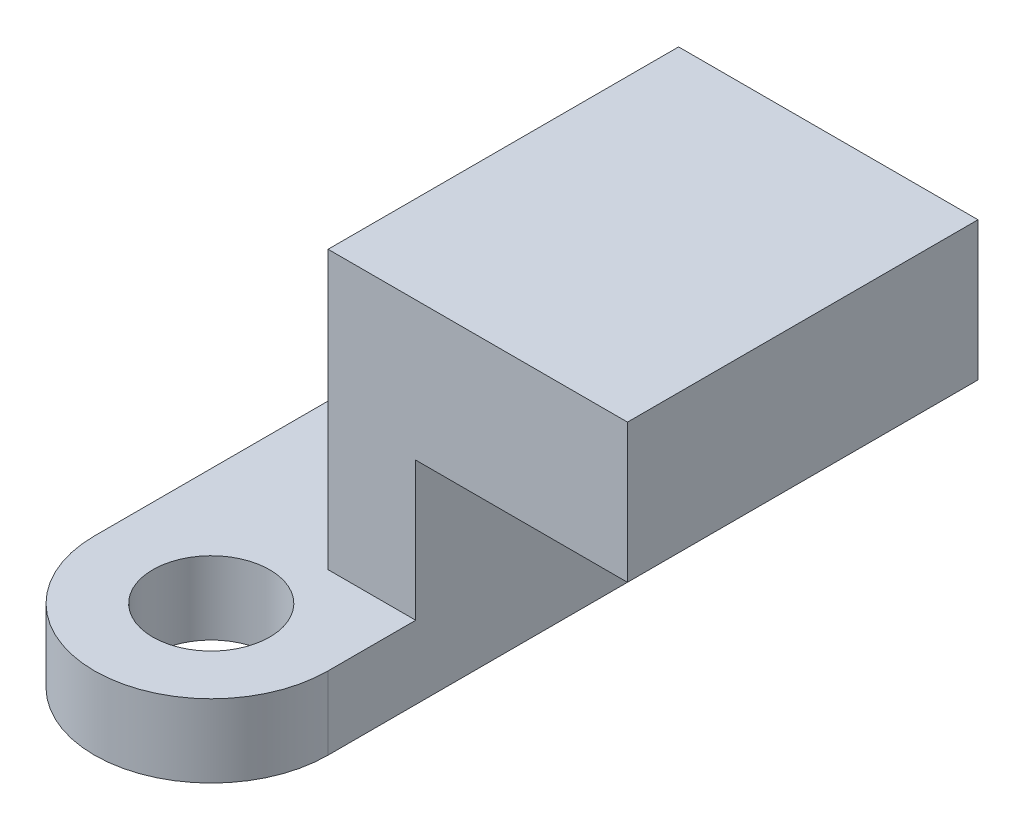
ISO-10303-21;
HEADER;
FILE_DESCRIPTION(('STEP AP214'),'2;1');
FILE_NAME('part.step','',(''),(''),'','','');
FILE_SCHEMA(('AUTOMOTIVE_DESIGN { 1 0 10303 214 1 1 1 1 }'));
ENDSEC;
DATA;
#1=APPLICATION_CONTEXT('core data for automotive mechanical design processes');
#2=APPLICATION_PROTOCOL_DEFINITION('international standard','automotive_design',2000,#1);
#3=PRODUCT_CONTEXT('',#1,'mechanical');
#4=PRODUCT('Part','Part','',(#3));
#5=PRODUCT_RELATED_PRODUCT_CATEGORY('part','',(#4));
#6=PRODUCT_DEFINITION_FORMATION('','',#4);
#7=PRODUCT_DEFINITION_CONTEXT('part definition',#1,'design');
#8=PRODUCT_DEFINITION('design','',#6,#7);
#9=PRODUCT_DEFINITION_SHAPE('','',#8);
#10=(LENGTH_UNIT() NAMED_UNIT(*) SI_UNIT(.MILLI.,.METRE.));
#11=(NAMED_UNIT(*) PLANE_ANGLE_UNIT() SI_UNIT($,.RADIAN.));
#12=(NAMED_UNIT(*) SI_UNIT($,.STERADIAN.) SOLID_ANGLE_UNIT());
#13=UNCERTAINTY_MEASURE_WITH_UNIT(LENGTH_MEASURE(1.E-05),#10,'distance_accuracy_value','');
#14=(GEOMETRIC_REPRESENTATION_CONTEXT(3) GLOBAL_UNCERTAINTY_ASSIGNED_CONTEXT((#13)) GLOBAL_UNIT_ASSIGNED_CONTEXT((#10,
#11,#12)) REPRESENTATION_CONTEXT('',''));
#15=CARTESIAN_POINT('',(0.,0.,0.));
#16=DIRECTION('',(0.,0.,1.));
#17=DIRECTION('',(1.,0.,0.));
#18=AXIS2_PLACEMENT_3D('',#15,#16,#17);
#19=CARTESIAN_POINT('',(0.,10.,-36.));
#20=DIRECTION('',(0.,-1.,0.));
#21=DIRECTION('',(0.,0.,-1.));
#22=AXIS2_PLACEMENT_3D('',#19,#20,#21);
#23=CYLINDRICAL_SURFACE('',#22,16.);
#24=CARTESIAN_POINT('',(0.,0.,-36.));
#25=DIRECTION('',(0.,1.,0.));
#26=DIRECTION('',(0.,0.,1.));
#27=AXIS2_PLACEMENT_3D('',#24,#25,#26);
#28=CIRCLE('',#27,16.);
#29=CARTESIAN_POINT('',(16.,0.,-36.));
#30=VERTEX_POINT('',#29);
#31=CARTESIAN_POINT('',(-16.,0.,-36.));
#32=VERTEX_POINT('',#31);
#33=EDGE_CURVE('E165',#30,#32,#28,.T.);
#34=ORIENTED_EDGE('',*,*,#33,.T.);
#35=DIRECTION('',(0.,-1.,0.));
#36=VECTOR('',#35,1.);
#37=CARTESIAN_POINT('',(-16.,10.,-36.));
#38=LINE('',#37,#36);
#39=CARTESIAN_POINT('',(-16.,10.,-36.));
#40=VERTEX_POINT('',#39);
#41=EDGE_CURVE('E11',#40,#32,#38,.T.);
#42=ORIENTED_EDGE('',*,*,#41,.F.);
#43=CARTESIAN_POINT('',(0.,10.,-36.));
#44=DIRECTION('',(0.,1.,0.));
#45=DIRECTION('',(0.,0.,1.));
#46=AXIS2_PLACEMENT_3D('',#43,#44,#45);
#47=CIRCLE('',#46,16.);
#48=CARTESIAN_POINT('',(16.,10.,-36.));
#49=VERTEX_POINT('',#48);
#50=EDGE_CURVE('E190',#49,#40,#47,.T.);
#51=ORIENTED_EDGE('',*,*,#50,.F.);
#52=DIRECTION('',(0.,-1.,0.));
#53=VECTOR('',#52,1.);
#54=CARTESIAN_POINT('',(16.,10.,-36.));
#55=LINE('',#54,#53);
#56=EDGE_CURVE('E67',#49,#30,#55,.T.);
#57=ORIENTED_EDGE('',*,*,#56,.T.);
#58=EDGE_LOOP('',(#34,#42,#51,#57));
#59=FACE_BOUND('',#58,.T.);
#60=ADVANCED_FACE('F43',(#59),#23,.T.);
#61=CARTESIAN_POINT('',(-16.,10.,0.));
#62=DIRECTION('',(1.,0.,0.));
#63=DIRECTION('',(0.,0.,-1.));
#64=AXIS2_PLACEMENT_3D('',#61,#62,#63);
#65=PLANE('',#64);
#66=DIRECTION('',(0.,0.,1.));
#67=VECTOR('',#66,1.);
#68=CARTESIAN_POINT('',(-16.,0.,0.));
#69=LINE('',#68,#67);
#70=CARTESIAN_POINT('',(-16.,0.,36.));
#71=VERTEX_POINT('',#70);
#72=EDGE_CURVE('E168',#32,#71,#69,.T.);
#73=ORIENTED_EDGE('',*,*,#72,.T.);
#74=DIRECTION('',(0.,-1.,0.));
#75=VECTOR('',#74,1.);
#76=CARTESIAN_POINT('',(-16.,10.,36.));
#77=LINE('',#76,#75);
#78=CARTESIAN_POINT('',(-16.,10.,36.));
#79=VERTEX_POINT('',#78);
#80=EDGE_CURVE('E51',#79,#71,#77,.T.);
#81=ORIENTED_EDGE('',*,*,#80,.F.);
#82=DIRECTION('',(0.,0.,1.));
#83=VECTOR('',#82,1.);
#84=CARTESIAN_POINT('',(-16.,10.,0.));
#85=LINE('',#84,#83);
#86=EDGE_CURVE('E93',#40,#79,#85,.T.);
#87=ORIENTED_EDGE('',*,*,#86,.F.);
#88=ORIENTED_EDGE('',*,*,#41,.T.);
#89=EDGE_LOOP('',(#73,#81,#87,#88));
#90=FACE_BOUND('',#89,.T.);
#91=ADVANCED_FACE('F192',(#90),#65,.F.);
#92=CARTESIAN_POINT('',(0.,10.,36.));
#93=DIRECTION('',(0.,-1.,0.));
#94=DIRECTION('',(0.,0.,-1.));
#95=AXIS2_PLACEMENT_3D('',#92,#93,#94);
#96=CYLINDRICAL_SURFACE('',#95,16.);
#97=CARTESIAN_POINT('',(0.,0.,36.));
#98=DIRECTION('',(0.,1.,0.));
#99=DIRECTION('',(0.,0.,1.));
#100=AXIS2_PLACEMENT_3D('',#97,#98,#99);
#101=CIRCLE('',#100,16.);
#102=CARTESIAN_POINT('',(16.,0.,36.));
#103=VERTEX_POINT('',#102);
#104=EDGE_CURVE('E170',#71,#103,#101,.T.);
#105=ORIENTED_EDGE('',*,*,#104,.T.);
#106=DIRECTION('',(0.,-1.,0.));
#107=VECTOR('',#106,1.);
#108=CARTESIAN_POINT('',(16.,10.,36.));
#109=LINE('',#108,#107);
#110=CARTESIAN_POINT('',(16.,10.,36.));
#111=VERTEX_POINT('',#110);
#112=EDGE_CURVE('E181',#111,#103,#109,.T.);
#113=ORIENTED_EDGE('',*,*,#112,.F.);
#114=CARTESIAN_POINT('',(0.,10.,36.));
#115=DIRECTION('',(0.,1.,0.));
#116=DIRECTION('',(0.,0.,1.));
#117=AXIS2_PLACEMENT_3D('',#114,#115,#116);
#118=CIRCLE('',#117,16.);
#119=EDGE_CURVE('E152',#79,#111,#118,.T.);
#120=ORIENTED_EDGE('',*,*,#119,.F.);
#121=ORIENTED_EDGE('',*,*,#80,.T.);
#122=EDGE_LOOP('',(#105,#113,#120,#121));
#123=FACE_BOUND('',#122,.T.);
#124=ADVANCED_FACE('F185',(#123),#96,.T.);
#125=CARTESIAN_POINT('',(16.,10.,0.));
#126=DIRECTION('',(1.,0.,0.));
#127=DIRECTION('',(0.,0.,-1.));
#128=AXIS2_PLACEMENT_3D('',#125,#126,#127);
#129=PLANE('',#128);
#130=DIRECTION('',(0.,0.,1.));
#131=VECTOR('',#130,1.);
#132=CARTESIAN_POINT('',(16.,0.,0.));
#133=LINE('',#132,#131);
#134=EDGE_CURVE('E173',#30,#103,#133,.T.);
#135=ORIENTED_EDGE('',*,*,#134,.F.);
#136=ORIENTED_EDGE('',*,*,#56,.F.);
#137=DIRECTION('',(0.,0.,1.));
#138=VECTOR('',#137,1.);
#139=CARTESIAN_POINT('',(16.,10.,0.));
#140=LINE('',#139,#138);
#141=CARTESIAN_POINT('',(16.,10.,-24.));
#142=VERTEX_POINT('',#141);
#143=EDGE_CURVE('E154',#49,#142,#140,.T.);
#144=ORIENTED_EDGE('',*,*,#143,.T.);
#145=DIRECTION('',(0.,1.,0.));
#146=VECTOR('',#145,1.);
#147=CARTESIAN_POINT('',(16.,10.,-24.));
#148=LINE('',#147,#146);
#149=CARTESIAN_POINT('',(16.,29.,-24.));
#150=VERTEX_POINT('',#149);
#151=EDGE_CURVE('E58',#142,#150,#148,.T.);
#152=ORIENTED_EDGE('',*,*,#151,.T.);
#153=DIRECTION('',(0.,0.,1.));
#154=VECTOR('',#153,1.);
#155=CARTESIAN_POINT('',(16.,29.,-24.));
#156=LINE('',#155,#154);
#157=CARTESIAN_POINT('',(16.,29.,24.));
#158=VERTEX_POINT('',#157);
#159=EDGE_CURVE('E133',#150,#158,#156,.T.);
#160=ORIENTED_EDGE('',*,*,#159,.T.);
#161=DIRECTION('',(0.,1.,0.));
#162=VECTOR('',#161,1.);
#163=CARTESIAN_POINT('',(16.,10.,24.));
#164=LINE('',#163,#162);
#165=CARTESIAN_POINT('',(16.,10.,24.));
#166=VERTEX_POINT('',#165);
#167=EDGE_CURVE('E127',#166,#158,#164,.T.);
#168=ORIENTED_EDGE('',*,*,#167,.F.);
#169=EDGE_CURVE('E131',#166,#111,#140,.T.);
#170=ORIENTED_EDGE('',*,*,#169,.T.);
#171=ORIENTED_EDGE('',*,*,#112,.T.);
#172=EDGE_LOOP('',(#135,#136,#144,#152,#160,#168,#170,#171));
#173=FACE_BOUND('',#172,.T.);
#174=ADVANCED_FACE('F129',(#173),#129,.T.);
#175=CARTESIAN_POINT('',(0.,10.,-36.));
#176=DIRECTION('',(0.,-1.,0.));
#177=DIRECTION('',(0.,0.,-1.));
#178=AXIS2_PLACEMENT_3D('',#175,#176,#177);
#179=CYLINDRICAL_SURFACE('',#178,8.);
#180=CARTESIAN_POINT('',(0.,10.,-36.));
#181=DIRECTION('',(0.,1.,0.));
#182=DIRECTION('',(0.,0.,1.));
#183=AXIS2_PLACEMENT_3D('',#180,#181,#182);
#184=CIRCLE('',#183,8.);
#185=CARTESIAN_POINT('',(0.,10.,-28.));
#186=VERTEX_POINT('',#185);
#187=EDGE_CURVE('E179',#186,#186,#184,.T.);
#188=ORIENTED_EDGE('',*,*,#187,.T.);
#189=EDGE_LOOP('',(#188));
#190=FACE_BOUND('',#189,.T.);
#191=CARTESIAN_POINT('',(0.,0.,-36.));
#192=DIRECTION('',(0.,1.,0.));
#193=DIRECTION('',(0.,0.,1.));
#194=AXIS2_PLACEMENT_3D('',#191,#192,#193);
#195=CIRCLE('',#194,8.);
#196=CARTESIAN_POINT('',(0.,0.,-28.));
#197=VERTEX_POINT('',#196);
#198=EDGE_CURVE('E162',#197,#197,#195,.T.);
#199=ORIENTED_EDGE('',*,*,#198,.F.);
#200=EDGE_LOOP('',(#199));
#201=FACE_BOUND('',#200,.T.);
#202=ADVANCED_FACE('F45',(#190,#201),#179,.F.);
#203=CARTESIAN_POINT('',(0.,10.,36.));
#204=DIRECTION('',(0.,-1.,0.));
#205=DIRECTION('',(0.,0.,-1.));
#206=AXIS2_PLACEMENT_3D('',#203,#204,#205);
#207=CYLINDRICAL_SURFACE('',#206,8.);
#208=CARTESIAN_POINT('',(0.,10.,36.));
#209=DIRECTION('',(0.,1.,0.));
#210=DIRECTION('',(0.,0.,1.));
#211=AXIS2_PLACEMENT_3D('',#208,#209,#210);
#212=CIRCLE('',#211,8.);
#213=CARTESIAN_POINT('',(0.,10.,44.));
#214=VERTEX_POINT('',#213);
#215=EDGE_CURVE('E156',#214,#214,#212,.T.);
#216=ORIENTED_EDGE('',*,*,#215,.T.);
#217=EDGE_LOOP('',(#216));
#218=FACE_BOUND('',#217,.T.);
#219=CARTESIAN_POINT('',(0.,0.,36.));
#220=DIRECTION('',(0.,1.,0.));
#221=DIRECTION('',(0.,0.,1.));
#222=AXIS2_PLACEMENT_3D('',#219,#220,#221);
#223=CIRCLE('',#222,8.);
#224=CARTESIAN_POINT('',(0.,0.,44.));
#225=VERTEX_POINT('',#224);
#226=EDGE_CURVE('E176',#225,#225,#223,.T.);
#227=ORIENTED_EDGE('',*,*,#226,.F.);
#228=EDGE_LOOP('',(#227));
#229=FACE_BOUND('',#228,.T.);
#230=ADVANCED_FACE('F203',(#218,#229),#207,.F.);
#231=CARTESIAN_POINT('',(0.,10.,0.));
#232=DIRECTION('',(0.,1.,0.));
#233=DIRECTION('',(0.,0.,1.));
#234=AXIS2_PLACEMENT_3D('',#231,#232,#233);
#235=PLANE('',#234);
#236=DIRECTION('',(1.,0.,0.));
#237=VECTOR('',#236,1.);
#238=CARTESIAN_POINT('',(4.,10.,24.));
#239=LINE('',#238,#237);
#240=CARTESIAN_POINT('',(4.,10.,24.));
#241=VERTEX_POINT('',#240);
#242=EDGE_CURVE('E138',#241,#166,#239,.T.);
#243=ORIENTED_EDGE('',*,*,#242,.F.);
#244=DIRECTION('',(0.,0.,1.));
#245=VECTOR('',#244,1.);
#246=CARTESIAN_POINT('',(4.,10.,-24.));
#247=LINE('',#246,#245);
#248=CARTESIAN_POINT('',(4.,10.,-24.));
#249=VERTEX_POINT('',#248);
#250=EDGE_CURVE('E166',#249,#241,#247,.T.);
#251=ORIENTED_EDGE('',*,*,#250,.F.);
#252=DIRECTION('',(1.,0.,0.));
#253=VECTOR('',#252,1.);
#254=CARTESIAN_POINT('',(4.,10.,-24.));
#255=LINE('',#254,#253);
#256=EDGE_CURVE('E373',#249,#142,#255,.T.);
#257=ORIENTED_EDGE('',*,*,#256,.T.);
#258=ORIENTED_EDGE('',*,*,#143,.F.);
#259=ORIENTED_EDGE('',*,*,#50,.T.);
#260=ORIENTED_EDGE('',*,*,#86,.T.);
#261=ORIENTED_EDGE('',*,*,#119,.T.);
#262=ORIENTED_EDGE('',*,*,#169,.F.);
#263=EDGE_LOOP('',(#243,#251,#257,#258,#259,#260,#261,#262));
#264=FACE_BOUND('',#263,.T.);
#265=ORIENTED_EDGE('',*,*,#187,.F.);
#266=EDGE_LOOP('',(#265));
#267=FACE_BOUND('',#266,.T.);
#268=ORIENTED_EDGE('',*,*,#215,.F.);
#269=EDGE_LOOP('',(#268));
#270=FACE_BOUND('',#269,.T.);
#271=ADVANCED_FACE('F149',(#264,#267,#270),#235,.T.);
#272=CARTESIAN_POINT('',(0.,0.,0.));
#273=DIRECTION('',(0.,1.,0.));
#274=DIRECTION('',(0.,0.,1.));
#275=AXIS2_PLACEMENT_3D('',#272,#273,#274);
#276=PLANE('',#275);
#277=ORIENTED_EDGE('',*,*,#198,.T.);
#278=EDGE_LOOP('',(#277));
#279=FACE_BOUND('',#278,.T.);
#280=ORIENTED_EDGE('',*,*,#33,.F.);
#281=ORIENTED_EDGE('',*,*,#134,.T.);
#282=ORIENTED_EDGE('',*,*,#104,.F.);
#283=ORIENTED_EDGE('',*,*,#72,.F.);
#284=EDGE_LOOP('',(#280,#281,#282,#283));
#285=FACE_BOUND('',#284,.T.);
#286=ORIENTED_EDGE('',*,*,#226,.T.);
#287=EDGE_LOOP('',(#286));
#288=FACE_BOUND('',#287,.T.);
#289=ADVANCED_FACE('F187',(#279,#285,#288),#276,.F.);
#290=CARTESIAN_POINT('',(3.99999999999999,48.,-24.));
#291=DIRECTION('',(-1.,0.,0.));
#292=DIRECTION('',(0.,-1.,0.));
#293=AXIS2_PLACEMENT_3D('',#290,#291,#292);
#294=PLANE('',#293);
#295=ORIENTED_EDGE('',*,*,#250,.T.);
#296=DIRECTION('',(0.,-1.,0.));
#297=VECTOR('',#296,1.);
#298=CARTESIAN_POINT('',(3.99999999999999,48.,24.));
#299=LINE('',#298,#297);
#300=CARTESIAN_POINT('',(3.99999999999999,48.,24.));
#301=VERTEX_POINT('',#300);
#302=EDGE_CURVE('E145',#301,#241,#299,.T.);
#303=ORIENTED_EDGE('',*,*,#302,.F.);
#304=DIRECTION('',(0.,0.,1.));
#305=VECTOR('',#304,1.);
#306=CARTESIAN_POINT('',(3.99999999999999,48.,-24.));
#307=LINE('',#306,#305);
#308=CARTESIAN_POINT('',(3.99999999999999,48.,-24.));
#309=VERTEX_POINT('',#308);
#310=EDGE_CURVE('E391',#309,#301,#307,.T.);
#311=ORIENTED_EDGE('',*,*,#310,.F.);
#312=DIRECTION('',(0.,-1.,0.));
#313=VECTOR('',#312,1.);
#314=CARTESIAN_POINT('',(3.99999999999999,48.,-24.));
#315=LINE('',#314,#313);
#316=EDGE_CURVE('E387',#309,#249,#315,.T.);
#317=ORIENTED_EDGE('',*,*,#316,.T.);
#318=EDGE_LOOP('',(#295,#303,#311,#317));
#319=FACE_BOUND('',#318,.T.);
#320=ADVANCED_FACE('F209',(#319),#294,.T.);
#321=CARTESIAN_POINT('',(45.,48.,-24.));
#322=DIRECTION('',(0.,1.,0.));
#323=DIRECTION('',(-1.,0.,0.));
#324=AXIS2_PLACEMENT_3D('',#321,#322,#323);
#325=PLANE('',#324);
#326=ORIENTED_EDGE('',*,*,#310,.T.);
#327=DIRECTION('',(-1.,0.,0.));
#328=VECTOR('',#327,1.);
#329=CARTESIAN_POINT('',(45.,48.,24.));
#330=LINE('',#329,#328);
#331=CARTESIAN_POINT('',(45.,48.,24.));
#332=VERTEX_POINT('',#331);
#333=EDGE_CURVE('E401',#332,#301,#330,.T.);
#334=ORIENTED_EDGE('',*,*,#333,.F.);
#335=DIRECTION('',(0.,0.,1.));
#336=VECTOR('',#335,1.);
#337=CARTESIAN_POINT('',(45.,48.,-24.));
#338=LINE('',#337,#336);
#339=CARTESIAN_POINT('',(45.,48.,-24.));
#340=VERTEX_POINT('',#339);
#341=EDGE_CURVE('E393',#340,#332,#338,.T.);
#342=ORIENTED_EDGE('',*,*,#341,.F.);
#343=DIRECTION('',(-1.,0.,0.));
#344=VECTOR('',#343,1.);
#345=CARTESIAN_POINT('',(45.,48.,-24.));
#346=LINE('',#345,#344);
#347=EDGE_CURVE('E384',#340,#309,#346,.T.);
#348=ORIENTED_EDGE('',*,*,#347,.T.);
#349=EDGE_LOOP('',(#326,#334,#342,#348));
#350=FACE_BOUND('',#349,.T.);
#351=ADVANCED_FACE('F221',(#350),#325,.T.);
#352=CARTESIAN_POINT('',(45.,29.,-24.));
#353=DIRECTION('',(1.,0.,0.));
#354=DIRECTION('',(0.,0.,-1.));
#355=AXIS2_PLACEMENT_3D('',#352,#353,#354);
#356=PLANE('',#355);
#357=ORIENTED_EDGE('',*,*,#341,.T.);
#358=DIRECTION('',(0.,1.,0.));
#359=VECTOR('',#358,1.);
#360=CARTESIAN_POINT('',(45.,29.,24.));
#361=LINE('',#360,#359);
#362=CARTESIAN_POINT('',(45.,29.,24.));
#363=VERTEX_POINT('',#362);
#364=EDGE_CURVE('E398',#363,#332,#361,.T.);
#365=ORIENTED_EDGE('',*,*,#364,.F.);
#366=DIRECTION('',(0.,0.,1.));
#367=VECTOR('',#366,1.);
#368=CARTESIAN_POINT('',(45.,29.,-24.));
#369=LINE('',#368,#367);
#370=CARTESIAN_POINT('',(45.,29.,-24.));
#371=VERTEX_POINT('',#370);
#372=EDGE_CURVE('E394',#371,#363,#369,.T.);
#373=ORIENTED_EDGE('',*,*,#372,.F.);
#374=DIRECTION('',(0.,1.,0.));
#375=VECTOR('',#374,1.);
#376=CARTESIAN_POINT('',(45.,29.,-24.));
#377=LINE('',#376,#375);
#378=EDGE_CURVE('E377',#371,#340,#377,.T.);
#379=ORIENTED_EDGE('',*,*,#378,.T.);
#380=EDGE_LOOP('',(#357,#365,#373,#379));
#381=FACE_BOUND('',#380,.T.);
#382=ADVANCED_FACE('F217',(#381),#356,.T.);
#383=CARTESIAN_POINT('',(16.,29.,-24.));
#384=DIRECTION('',(0.,-1.,0.));
#385=DIRECTION('',(0.,0.,-1.));
#386=AXIS2_PLACEMENT_3D('',#383,#384,#385);
#387=PLANE('',#386);
#388=ORIENTED_EDGE('',*,*,#372,.T.);
#389=DIRECTION('',(1.,0.,0.));
#390=VECTOR('',#389,1.);
#391=CARTESIAN_POINT('',(16.,29.,24.));
#392=LINE('',#391,#390);
#393=EDGE_CURVE('E137',#158,#363,#392,.T.);
#394=ORIENTED_EDGE('',*,*,#393,.F.);
#395=ORIENTED_EDGE('',*,*,#159,.F.);
#396=DIRECTION('',(1.,0.,0.));
#397=VECTOR('',#396,1.);
#398=CARTESIAN_POINT('',(16.,29.,-24.));
#399=LINE('',#398,#397);
#400=EDGE_CURVE('E374',#150,#371,#399,.T.);
#401=ORIENTED_EDGE('',*,*,#400,.T.);
#402=EDGE_LOOP('',(#388,#394,#395,#401));
#403=FACE_BOUND('',#402,.T.);
#404=ADVANCED_FACE('F213',(#403),#387,.T.);
#405=CARTESIAN_POINT('',(0.,0.,-24.));
#406=DIRECTION('',(0.,0.,1.));
#407=DIRECTION('',(1.,0.,0.));
#408=AXIS2_PLACEMENT_3D('',#405,#406,#407);
#409=PLANE('',#408);
#410=ORIENTED_EDGE('',*,*,#256,.F.);
#411=ORIENTED_EDGE('',*,*,#316,.F.);
#412=ORIENTED_EDGE('',*,*,#347,.F.);
#413=ORIENTED_EDGE('',*,*,#378,.F.);
#414=ORIENTED_EDGE('',*,*,#400,.F.);
#415=ORIENTED_EDGE('',*,*,#151,.F.);
#416=EDGE_LOOP('',(#410,#411,#412,#413,#414,#415));
#417=FACE_BOUND('',#416,.T.);
#418=ADVANCED_FACE('F216',(#417),#409,.F.);
#419=CARTESIAN_POINT('',(0.,0.,24.));
#420=DIRECTION('',(0.,0.,1.));
#421=DIRECTION('',(1.,0.,0.));
#422=AXIS2_PLACEMENT_3D('',#419,#420,#421);
#423=PLANE('',#422);
#424=ORIENTED_EDGE('',*,*,#242,.T.);
#425=ORIENTED_EDGE('',*,*,#167,.T.);
#426=ORIENTED_EDGE('',*,*,#393,.T.);
#427=ORIENTED_EDGE('',*,*,#364,.T.);
#428=ORIENTED_EDGE('',*,*,#333,.T.);
#429=ORIENTED_EDGE('',*,*,#302,.T.);
#430=EDGE_LOOP('',(#424,#425,#426,#427,#428,#429));
#431=FACE_BOUND('',#430,.T.);
#432=ADVANCED_FACE('F142',(#431),#423,.T.);
#433=CLOSED_SHELL('',(#60,#91,#124,#174,#202,#230,#271,#289,#320,#351,#382,#404,#418,#432));
#434=MANIFOLD_SOLID_BREP('B2',#433);
#435=ADVANCED_BREP_SHAPE_REPRESENTATION('',(#18,#434),#14);
#436=SHAPE_DEFINITION_REPRESENTATION(#9,#435);
ENDSEC;
END-ISO-10303-21;
